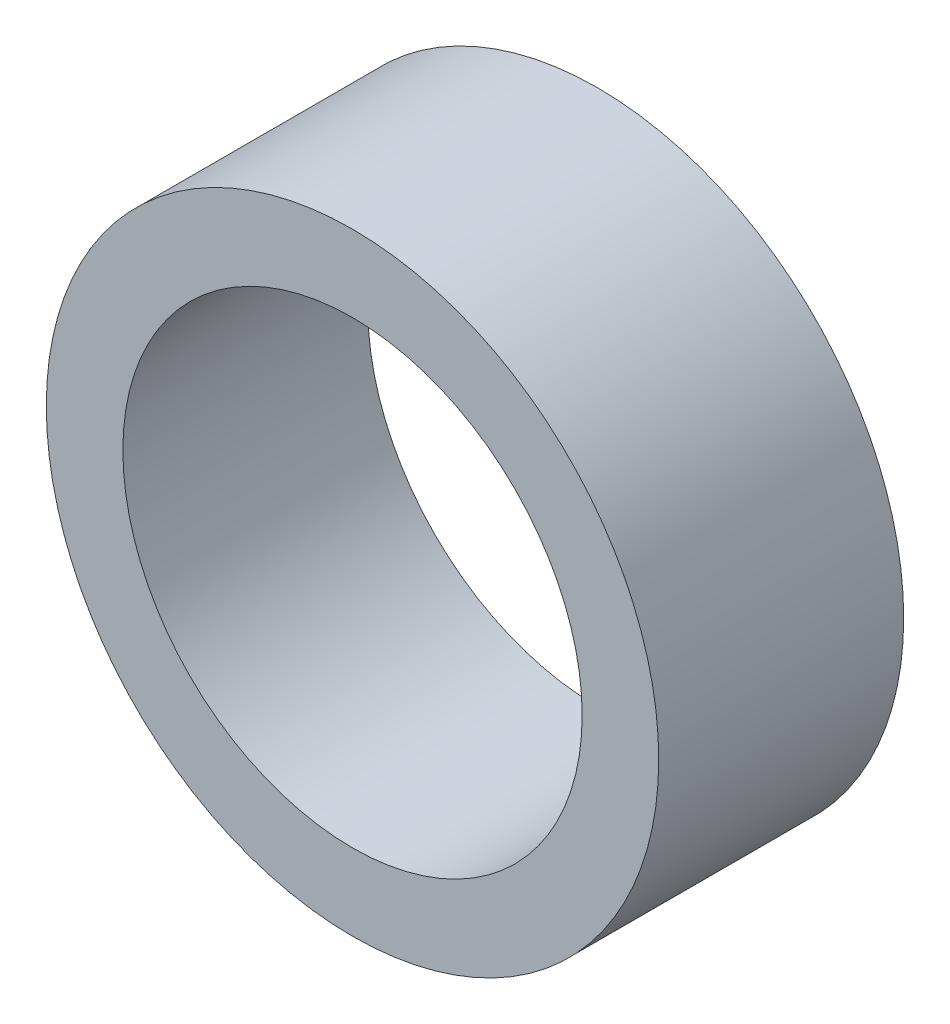
ISO-10303-21;
HEADER;
FILE_DESCRIPTION(('STEP AP214'),'2;1');
FILE_NAME('part.step','',(''),(''),'','','');
FILE_SCHEMA(('AUTOMOTIVE_DESIGN { 1 0 10303 214 1 1 1 1 }'));
ENDSEC;
DATA;
#1=APPLICATION_CONTEXT('core data for automotive mechanical design processes');
#2=APPLICATION_PROTOCOL_DEFINITION('international standard','automotive_design',2000,#1);
#3=PRODUCT_CONTEXT('',#1,'mechanical');
#4=PRODUCT('Part','Part','',(#3));
#5=PRODUCT_RELATED_PRODUCT_CATEGORY('part','',(#4));
#6=PRODUCT_DEFINITION_FORMATION('','',#4);
#7=PRODUCT_DEFINITION_CONTEXT('part definition',#1,'design');
#8=PRODUCT_DEFINITION('design','',#6,#7);
#9=PRODUCT_DEFINITION_SHAPE('','',#8);
#10=(LENGTH_UNIT() NAMED_UNIT(*) SI_UNIT(.MILLI.,.METRE.));
#11=(NAMED_UNIT(*) PLANE_ANGLE_UNIT() SI_UNIT($,.RADIAN.));
#12=(NAMED_UNIT(*) SI_UNIT($,.STERADIAN.) SOLID_ANGLE_UNIT());
#13=UNCERTAINTY_MEASURE_WITH_UNIT(LENGTH_MEASURE(1.E-05),#10,'distance_accuracy_value','');
#14=(GEOMETRIC_REPRESENTATION_CONTEXT(3) GLOBAL_UNCERTAINTY_ASSIGNED_CONTEXT((#13)) GLOBAL_UNIT_ASSIGNED_CONTEXT((#10,
#11,#12)) REPRESENTATION_CONTEXT('',''));
#15=CARTESIAN_POINT('',(0.,0.,0.));
#16=DIRECTION('',(0.,0.,1.));
#17=DIRECTION('',(1.,0.,0.));
#18=AXIS2_PLACEMENT_3D('',#15,#16,#17);
#19=CARTESIAN_POINT('',(0.,0.,3.2));
#20=DIRECTION('',(0.,0.,1.));
#21=DIRECTION('',(1.,0.,0.));
#22=AXIS2_PLACEMENT_3D('',#19,#20,#21);
#23=PLANE('',#22);
#24=CARTESIAN_POINT('',(0.,0.,3.2));
#25=DIRECTION('',(0.,0.,1.));
#26=DIRECTION('',(1.,0.,0.));
#27=AXIS2_PLACEMENT_3D('',#24,#25,#26);
#28=CIRCLE('',#27,4.);
#29=CARTESIAN_POINT('',(4.,0.,3.2));
#30=VERTEX_POINT('',#29);
#31=EDGE_CURVE('E10',#30,#30,#28,.T.);
#32=ORIENTED_EDGE('',*,*,#31,.T.);
#33=EDGE_LOOP('',(#32));
#34=FACE_BOUND('',#33,.T.);
#35=CARTESIAN_POINT('',(0.,0.,3.2));
#36=DIRECTION('',(0.,0.,1.));
#37=DIRECTION('',(1.,0.,0.));
#38=AXIS2_PLACEMENT_3D('',#35,#36,#37);
#39=CIRCLE('',#38,3.);
#40=CARTESIAN_POINT('',(3.,0.,3.2));
#41=VERTEX_POINT('',#40);
#42=EDGE_CURVE('E52',#41,#41,#39,.T.);
#43=ORIENTED_EDGE('',*,*,#42,.F.);
#44=EDGE_LOOP('',(#43));
#45=FACE_BOUND('',#44,.T.);
#46=ADVANCED_FACE('F39',(#34,#45),#23,.T.);
#47=CARTESIAN_POINT('',(0.,0.,0.));
#48=DIRECTION('',(0.,0.,1.));
#49=DIRECTION('',(1.,0.,0.));
#50=AXIS2_PLACEMENT_3D('',#47,#48,#49);
#51=PLANE('',#50);
#52=CARTESIAN_POINT('',(0.,0.,0.));
#53=DIRECTION('',(0.,0.,1.));
#54=DIRECTION('',(1.,0.,0.));
#55=AXIS2_PLACEMENT_3D('',#52,#53,#54);
#56=CIRCLE('',#55,4.);
#57=CARTESIAN_POINT('',(4.,0.,0.));
#58=VERTEX_POINT('',#57);
#59=EDGE_CURVE('E43',#58,#58,#56,.T.);
#60=ORIENTED_EDGE('',*,*,#59,.F.);
#61=EDGE_LOOP('',(#60));
#62=FACE_BOUND('',#61,.T.);
#63=CARTESIAN_POINT('',(0.,0.,0.));
#64=DIRECTION('',(0.,0.,1.));
#65=DIRECTION('',(1.,0.,0.));
#66=AXIS2_PLACEMENT_3D('',#63,#64,#65);
#67=CIRCLE('',#66,3.);
#68=CARTESIAN_POINT('',(3.,0.,0.));
#69=VERTEX_POINT('',#68);
#70=EDGE_CURVE('E54',#69,#69,#67,.T.);
#71=ORIENTED_EDGE('',*,*,#70,.T.);
#72=EDGE_LOOP('',(#71));
#73=FACE_BOUND('',#72,.T.);
#74=ADVANCED_FACE('F66',(#62,#73),#51,.F.);
#75=CARTESIAN_POINT('',(0.,0.,3.2));
#76=DIRECTION('',(0.,0.,-1.));
#77=DIRECTION('',(-1.,0.,0.));
#78=AXIS2_PLACEMENT_3D('',#75,#76,#77);
#79=CYLINDRICAL_SURFACE('',#78,4.);
#80=ORIENTED_EDGE('',*,*,#31,.F.);
#81=EDGE_LOOP('',(#80));
#82=FACE_BOUND('',#81,.T.);
#83=ORIENTED_EDGE('',*,*,#59,.T.);
#84=EDGE_LOOP('',(#83));
#85=FACE_BOUND('',#84,.T.);
#86=ADVANCED_FACE('F41',(#82,#85),#79,.T.);
#87=CARTESIAN_POINT('',(0.,0.,3.2));
#88=DIRECTION('',(0.,0.,-1.));
#89=DIRECTION('',(-1.,0.,0.));
#90=AXIS2_PLACEMENT_3D('',#87,#88,#89);
#91=CYLINDRICAL_SURFACE('',#90,3.);
#92=ORIENTED_EDGE('',*,*,#42,.T.);
#93=EDGE_LOOP('',(#92));
#94=FACE_BOUND('',#93,.T.);
#95=ORIENTED_EDGE('',*,*,#70,.F.);
#96=EDGE_LOOP('',(#95));
#97=FACE_BOUND('',#96,.T.);
#98=ADVANCED_FACE('F62',(#94,#97),#91,.F.);
#99=CLOSED_SHELL('',(#46,#74,#86,#98));
#100=MANIFOLD_SOLID_BREP('B2',#99);
#101=ADVANCED_BREP_SHAPE_REPRESENTATION('',(#18,#100),#14);
#102=SHAPE_DEFINITION_REPRESENTATION(#9,#101);
ENDSEC;
END-ISO-10303-21;
